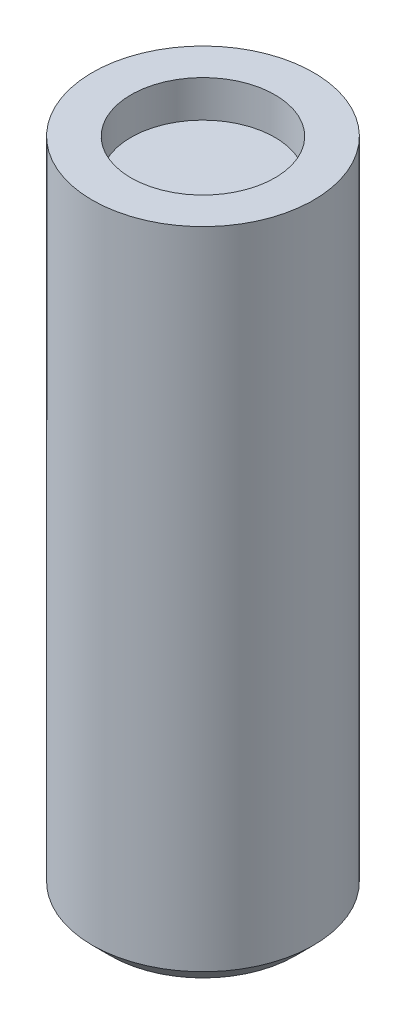
ISO-10303-21;
HEADER;
FILE_DESCRIPTION(('STEP AP214'),'2;1');
FILE_NAME('part.step','',(''),(''),'','','');
FILE_SCHEMA(('AUTOMOTIVE_DESIGN { 1 0 10303 214 1 1 1 1 }'));
ENDSEC;
DATA;
#1=APPLICATION_CONTEXT('core data for automotive mechanical design processes');
#2=APPLICATION_PROTOCOL_DEFINITION('international standard','automotive_design',2000,#1);
#3=PRODUCT_CONTEXT('',#1,'mechanical');
#4=PRODUCT('Part','Part','',(#3));
#5=PRODUCT_RELATED_PRODUCT_CATEGORY('part','',(#4));
#6=PRODUCT_DEFINITION_FORMATION('','',#4);
#7=PRODUCT_DEFINITION_CONTEXT('part definition',#1,'design');
#8=PRODUCT_DEFINITION('design','',#6,#7);
#9=PRODUCT_DEFINITION_SHAPE('','',#8);
#10=(LENGTH_UNIT() NAMED_UNIT(*) SI_UNIT(.MILLI.,.METRE.));
#11=(NAMED_UNIT(*) PLANE_ANGLE_UNIT() SI_UNIT($,.RADIAN.));
#12=(NAMED_UNIT(*) SI_UNIT($,.STERADIAN.) SOLID_ANGLE_UNIT());
#13=UNCERTAINTY_MEASURE_WITH_UNIT(LENGTH_MEASURE(1.E-05),#10,'distance_accuracy_value','');
#14=(GEOMETRIC_REPRESENTATION_CONTEXT(3) GLOBAL_UNCERTAINTY_ASSIGNED_CONTEXT((#13)) GLOBAL_UNIT_ASSIGNED_CONTEXT((#10,
#11,#12)) REPRESENTATION_CONTEXT('',''));
#15=CARTESIAN_POINT('',(0.,0.,0.));
#16=DIRECTION('',(0.,0.,1.));
#17=DIRECTION('',(1.,0.,0.));
#18=AXIS2_PLACEMENT_3D('',#15,#16,#17);
#19=CARTESIAN_POINT('',(0.,3.6,0.));
#20=DIRECTION('',(0.,-1.,0.));
#21=DIRECTION('',(0.,0.,-1.));
#22=AXIS2_PLACEMENT_3D('',#19,#20,#21);
#23=CYLINDRICAL_SURFACE('',#22,0.6);
#24=CARTESIAN_POINT('',(0.,0.100000000000001,0.));
#25=DIRECTION('',(0.,1.,0.));
#26=DIRECTION('',(0.,0.,1.));
#27=AXIS2_PLACEMENT_3D('',#24,#25,#26);
#28=CIRCLE('',#27,0.6);
#29=CARTESIAN_POINT('',(0.,0.100000000000001,0.6));
#30=VERTEX_POINT('',#29);
#31=EDGE_CURVE('E38',#30,#30,#28,.T.);
#32=ORIENTED_EDGE('',*,*,#31,.T.);
#33=EDGE_LOOP('',(#32));
#34=FACE_BOUND('',#33,.T.);
#35=CARTESIAN_POINT('',(0.,3.6,0.));
#36=DIRECTION('',(0.,1.,0.));
#37=DIRECTION('',(0.,0.,1.));
#38=AXIS2_PLACEMENT_3D('',#35,#36,#37);
#39=CIRCLE('',#38,0.6);
#40=CARTESIAN_POINT('',(0.,3.6,0.6));
#41=VERTEX_POINT('',#40);
#42=EDGE_CURVE('E42',#41,#41,#39,.T.);
#43=ORIENTED_EDGE('',*,*,#42,.F.);
#44=EDGE_LOOP('',(#43));
#45=FACE_BOUND('',#44,.T.);
#46=ADVANCED_FACE('F31',(#34,#45),#23,.T.);
#47=CARTESIAN_POINT('',(0.,3.6,0.));
#48=DIRECTION('',(0.,1.,0.));
#49=DIRECTION('',(0.,0.,1.));
#50=AXIS2_PLACEMENT_3D('',#47,#48,#49);
#51=PLANE('',#50);
#52=CARTESIAN_POINT('',(0.,3.6,0.));
#53=DIRECTION('',(0.,1.,0.));
#54=DIRECTION('',(0.,0.,1.));
#55=AXIS2_PLACEMENT_3D('',#52,#53,#54);
#56=CIRCLE('',#55,0.390493672156207);
#57=CARTESIAN_POINT('',(0.,3.6,0.390493672156207));
#58=VERTEX_POINT('',#57);
#59=EDGE_CURVE('E49',#58,#58,#56,.T.);
#60=ORIENTED_EDGE('',*,*,#59,.F.);
#61=EDGE_LOOP('',(#60));
#62=FACE_BOUND('',#61,.T.);
#63=ORIENTED_EDGE('',*,*,#42,.T.);
#64=EDGE_LOOP('',(#63));
#65=FACE_BOUND('',#64,.T.);
#66=ADVANCED_FACE('F63',(#62,#65),#51,.T.);
#67=CARTESIAN_POINT('',(0.,0.,0.));
#68=DIRECTION('',(0.,1.,0.));
#69=DIRECTION('',(0.,0.,1.));
#70=AXIS2_PLACEMENT_3D('',#67,#68,#69);
#71=PLANE('',#70);
#72=CARTESIAN_POINT('',(0.,0.,0.));
#73=DIRECTION('',(0.,1.,0.));
#74=DIRECTION('',(0.,0.,1.));
#75=AXIS2_PLACEMENT_3D('',#72,#73,#74);
#76=CIRCLE('',#75,0.499999999999999);
#77=CARTESIAN_POINT('',(0.,0.,0.499999999999999));
#78=VERTEX_POINT('',#77);
#79=EDGE_CURVE('E10',#78,#78,#76,.F.);
#80=ORIENTED_EDGE('',*,*,#79,.T.);
#81=EDGE_LOOP('',(#80));
#82=FACE_BOUND('',#81,.T.);
#83=ADVANCED_FACE('F66',(#82),#71,.F.);
#84=CARTESIAN_POINT('',(0.,0.100000000000001,0.));
#85=DIRECTION('',(0.,1.,0.));
#86=DIRECTION('',(0.,0.,1.));
#87=AXIS2_PLACEMENT_3D('',#84,#85,#86);
#88=CONICAL_SURFACE('',#87,0.6,0.78539816339745);
#89=ORIENTED_EDGE('',*,*,#79,.F.);
#90=EDGE_LOOP('',(#89));
#91=FACE_BOUND('',#90,.T.);
#92=ORIENTED_EDGE('',*,*,#31,.F.);
#93=EDGE_LOOP('',(#92));
#94=FACE_BOUND('',#93,.T.);
#95=ADVANCED_FACE('F33',(#91,#94),#88,.T.);
#96=CARTESIAN_POINT('',(0.,3.4,0.));
#97=DIRECTION('',(0.,1.,0.));
#98=DIRECTION('',(0.,0.,1.));
#99=AXIS2_PLACEMENT_3D('',#96,#97,#98);
#100=CYLINDRICAL_SURFACE('',#99,0.390493672156207);
#101=CARTESIAN_POINT('',(0.,3.4,0.));
#102=DIRECTION('',(0.,1.,0.));
#103=DIRECTION('',(0.,0.,1.));
#104=AXIS2_PLACEMENT_3D('',#101,#102,#103);
#105=CIRCLE('',#104,0.390493672156207);
#106=CARTESIAN_POINT('',(0.,3.4,0.390493672156207));
#107=VERTEX_POINT('',#106);
#108=EDGE_CURVE('E46',#107,#107,#105,.T.);
#109=ORIENTED_EDGE('',*,*,#108,.F.);
#110=EDGE_LOOP('',(#109));
#111=FACE_BOUND('',#110,.T.);
#112=ORIENTED_EDGE('',*,*,#59,.T.);
#113=EDGE_LOOP('',(#112));
#114=FACE_BOUND('',#113,.T.);
#115=ADVANCED_FACE('F57',(#111,#114),#100,.F.);
#116=CARTESIAN_POINT('',(0.,3.4,0.));
#117=DIRECTION('',(0.,1.,0.));
#118=DIRECTION('',(0.,0.,1.));
#119=AXIS2_PLACEMENT_3D('',#116,#117,#118);
#120=PLANE('',#119);
#121=ORIENTED_EDGE('',*,*,#108,.T.);
#122=EDGE_LOOP('',(#121));
#123=FACE_BOUND('',#122,.T.);
#124=ADVANCED_FACE('F55',(#123),#120,.T.);
#125=CLOSED_SHELL('',(#46,#66,#83,#95,#115,#124));
#126=MANIFOLD_SOLID_BREP('B2',#125);
#127=ADVANCED_BREP_SHAPE_REPRESENTATION('',(#18,#126),#14);
#128=SHAPE_DEFINITION_REPRESENTATION(#9,#127);
ENDSEC;
END-ISO-10303-21;
